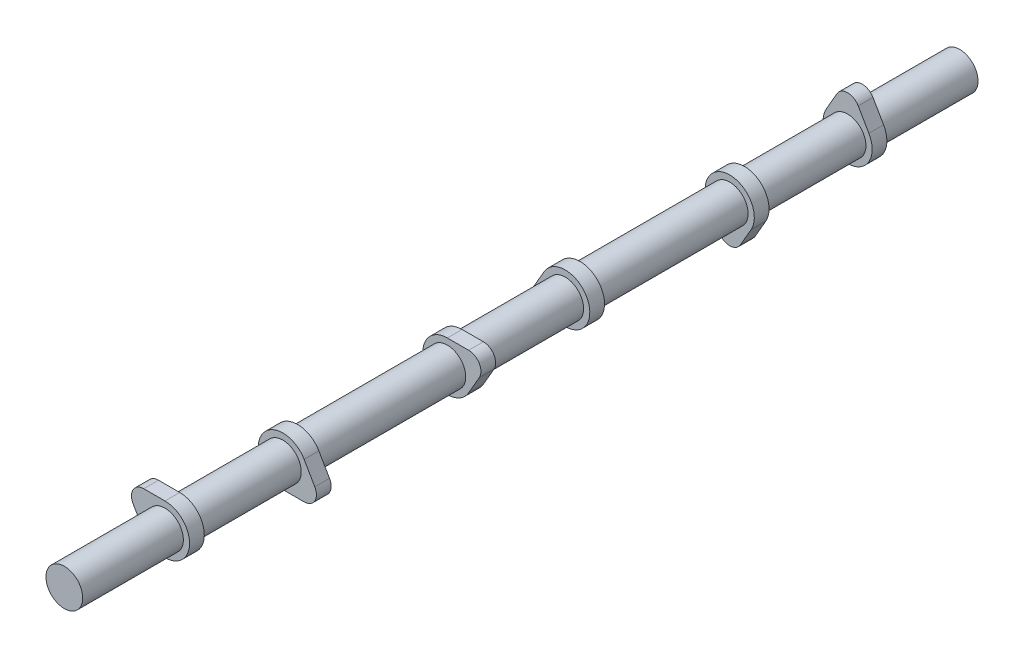
ISO-10303-21;
HEADER;
FILE_DESCRIPTION(('STEP AP214'),'2;1');
FILE_NAME('part.step','',(''),(''),'','','');
FILE_SCHEMA(('AUTOMOTIVE_DESIGN { 1 0 10303 214 1 1 1 1 }'));
ENDSEC;
DATA;
#1=APPLICATION_CONTEXT('core data for automotive mechanical design processes');
#2=APPLICATION_PROTOCOL_DEFINITION('international standard','automotive_design',2000,#1);
#3=PRODUCT_CONTEXT('',#1,'mechanical');
#4=PRODUCT('Part','Part','',(#3));
#5=PRODUCT_RELATED_PRODUCT_CATEGORY('part','',(#4));
#6=PRODUCT_DEFINITION_FORMATION('','',#4);
#7=PRODUCT_DEFINITION_CONTEXT('part definition',#1,'design');
#8=PRODUCT_DEFINITION('design','',#6,#7);
#9=PRODUCT_DEFINITION_SHAPE('','',#8);
#10=(LENGTH_UNIT() NAMED_UNIT(*) SI_UNIT(.MILLI.,.METRE.));
#11=(NAMED_UNIT(*) PLANE_ANGLE_UNIT() SI_UNIT($,.RADIAN.));
#12=(NAMED_UNIT(*) SI_UNIT($,.STERADIAN.) SOLID_ANGLE_UNIT());
#13=UNCERTAINTY_MEASURE_WITH_UNIT(LENGTH_MEASURE(1.E-05),#10,'distance_accuracy_value','');
#14=(GEOMETRIC_REPRESENTATION_CONTEXT(3) GLOBAL_UNCERTAINTY_ASSIGNED_CONTEXT((#13)) GLOBAL_UNIT_ASSIGNED_CONTEXT((#10,
#11,#12)) REPRESENTATION_CONTEXT('',''));
#15=CARTESIAN_POINT('',(0.,0.,0.));
#16=DIRECTION('',(0.,0.,1.));
#17=DIRECTION('',(1.,0.,0.));
#18=AXIS2_PLACEMENT_3D('',#15,#16,#17);
#19=CARTESIAN_POINT('',(-10.9985226280624,6.34999999999998,360.68));
#20=DIRECTION('',(0.,0.,-1.));
#21=DIRECTION('',(-0.499999999999998,-0.86602540378444,0.));
#22=AXIS2_PLACEMENT_3D('',#19,#20,#21);
#23=CYLINDRICAL_SURFACE('',#22,6.35);
#24=CARTESIAN_POINT('',(-10.9985226280624,6.34999999999998,353.06));
#25=DIRECTION('',(0.,0.,1.));
#26=DIRECTION('',(0.499999999999998,0.86602540378444,0.));
#27=AXIS2_PLACEMENT_3D('',#24,#25,#26);
#28=CIRCLE('',#27,6.35);
#29=CARTESIAN_POINT('',(-10.9985226280624,12.7,353.06));
#30=VERTEX_POINT('',#29);
#31=CARTESIAN_POINT('',(-16.4977839420936,3.17499999999996,353.06));
#32=VERTEX_POINT('',#31);
#33=EDGE_CURVE('E386',#30,#32,#28,.T.);
#34=ORIENTED_EDGE('',*,*,#33,.T.);
#35=DIRECTION('',(0.,0.,-1.));
#36=VECTOR('',#35,1.);
#37=CARTESIAN_POINT('',(-16.4977839420936,3.17499999999996,360.68));
#38=LINE('',#37,#36);
#39=CARTESIAN_POINT('',(-16.4977839420936,3.17499999999996,360.68));
#40=VERTEX_POINT('',#39);
#41=EDGE_CURVE('E405',#40,#32,#38,.T.);
#42=ORIENTED_EDGE('',*,*,#41,.F.);
#43=CARTESIAN_POINT('',(-10.9985226280624,6.34999999999998,360.68));
#44=DIRECTION('',(0.,0.,1.));
#45=DIRECTION('',(0.499999999999998,0.86602540378444,0.));
#46=AXIS2_PLACEMENT_3D('',#43,#44,#45);
#47=CIRCLE('',#46,6.35);
#48=CARTESIAN_POINT('',(-10.9985226280624,12.7,360.68));
#49=VERTEX_POINT('',#48);
#50=EDGE_CURVE('E387',#49,#40,#47,.T.);
#51=ORIENTED_EDGE('',*,*,#50,.F.);
#52=DIRECTION('',(0.,0.,-1.));
#53=VECTOR('',#52,1.);
#54=CARTESIAN_POINT('',(-10.9985226280624,12.7,360.68));
#55=LINE('',#54,#53);
#56=EDGE_CURVE('E393',#49,#30,#55,.T.);
#57=ORIENTED_EDGE('',*,*,#56,.T.);
#58=EDGE_LOOP('',(#34,#42,#51,#57));
#59=FACE_BOUND('',#58,.T.);
#60=ADVANCED_FACE('F34',(#59),#23,.T.);
#61=CARTESIAN_POINT('',(-16.4977839420936,3.17499999999996,360.68));
#62=DIRECTION('',(0.866025403784437,0.500000000000002,0.));
#63=DIRECTION('',(-0.500000000000002,0.866025403784438,0.));
#64=AXIS2_PLACEMENT_3D('',#61,#62,#63);
#65=PLANE('',#64);
#66=DIRECTION('',(0.500000000000002,-0.866025403784438,0.));
#67=VECTOR('',#66,1.);
#68=CARTESIAN_POINT('',(-16.4977839420936,3.17499999999996,353.06));
#69=LINE('',#68,#67);
#70=CARTESIAN_POINT('',(-10.9985226280624,-6.35000000000002,353.06));
#71=VERTEX_POINT('',#70);
#72=EDGE_CURVE('E396',#32,#71,#69,.T.);
#73=ORIENTED_EDGE('',*,*,#72,.T.);
#74=DIRECTION('',(0.,0.,-1.));
#75=VECTOR('',#74,1.);
#76=CARTESIAN_POINT('',(-10.9985226280624,-6.35000000000002,360.68));
#77=LINE('',#76,#75);
#78=CARTESIAN_POINT('',(-10.9985226280624,-6.35000000000002,360.68));
#79=VERTEX_POINT('',#78);
#80=EDGE_CURVE('E403',#79,#71,#77,.T.);
#81=ORIENTED_EDGE('',*,*,#80,.F.);
#82=DIRECTION('',(0.500000000000002,-0.866025403784438,0.));
#83=VECTOR('',#82,1.);
#84=CARTESIAN_POINT('',(-16.4977839420936,3.17499999999996,360.68));
#85=LINE('',#84,#83);
#86=EDGE_CURVE('E83',#40,#79,#85,.T.);
#87=ORIENTED_EDGE('',*,*,#86,.F.);
#88=ORIENTED_EDGE('',*,*,#41,.T.);
#89=EDGE_LOOP('',(#73,#81,#87,#88));
#90=FACE_BOUND('',#89,.T.);
#91=ADVANCED_FACE('F424',(#90),#65,.F.);
#92=CARTESIAN_POINT('',(0.,0.,360.68));
#93=DIRECTION('',(0.,0.,-1.));
#94=DIRECTION('',(-0.499999999999998,-0.86602540378444,0.));
#95=AXIS2_PLACEMENT_3D('',#92,#93,#94);
#96=CYLINDRICAL_SURFACE('',#95,12.7);
#97=CARTESIAN_POINT('',(0.,0.,353.06));
#98=DIRECTION('',(0.,0.,1.));
#99=DIRECTION('',(0.499999999999998,0.86602540378444,0.));
#100=AXIS2_PLACEMENT_3D('',#97,#98,#99);
#101=CIRCLE('',#100,12.7);
#102=CARTESIAN_POINT('',(0.,12.7,353.06));
#103=VERTEX_POINT('',#102);
#104=EDGE_CURVE('E69',#71,#103,#101,.T.);
#105=ORIENTED_EDGE('',*,*,#104,.T.);
#106=DIRECTION('',(0.,0.,-1.));
#107=VECTOR('',#106,1.);
#108=CARTESIAN_POINT('',(0.,12.7,360.68));
#109=LINE('',#108,#107);
#110=CARTESIAN_POINT('',(0.,12.7,360.68));
#111=VERTEX_POINT('',#110);
#112=EDGE_CURVE('E401',#111,#103,#109,.T.);
#113=ORIENTED_EDGE('',*,*,#112,.F.);
#114=CARTESIAN_POINT('',(0.,0.,360.68));
#115=DIRECTION('',(0.,0.,1.));
#116=DIRECTION('',(0.499999999999998,0.86602540378444,0.));
#117=AXIS2_PLACEMENT_3D('',#114,#115,#116);
#118=CIRCLE('',#117,12.7);
#119=EDGE_CURVE('E390',#79,#111,#118,.T.);
#120=ORIENTED_EDGE('',*,*,#119,.F.);
#121=ORIENTED_EDGE('',*,*,#80,.T.);
#122=EDGE_LOOP('',(#105,#113,#120,#121));
#123=FACE_BOUND('',#122,.T.);
#124=ADVANCED_FACE('F423',(#123),#96,.T.);
#125=CARTESIAN_POINT('',(-10.9985226280624,12.7,360.68));
#126=DIRECTION('',(0.,-1.,0.));
#127=DIRECTION('',(1.,0.,0.));
#128=AXIS2_PLACEMENT_3D('',#125,#126,#127);
#129=PLANE('',#128);
#130=DIRECTION('',(-1.,0.,0.));
#131=VECTOR('',#130,1.);
#132=CARTESIAN_POINT('',(-10.9985226280624,12.7,353.06));
#133=LINE('',#132,#131);
#134=EDGE_CURVE('E75',#103,#30,#133,.T.);
#135=ORIENTED_EDGE('',*,*,#134,.T.);
#136=ORIENTED_EDGE('',*,*,#56,.F.);
#137=DIRECTION('',(-1.,0.,0.));
#138=VECTOR('',#137,1.);
#139=CARTESIAN_POINT('',(-10.9985226280624,12.7,360.68));
#140=LINE('',#139,#138);
#141=EDGE_CURVE('E51',#111,#49,#140,.T.);
#142=ORIENTED_EDGE('',*,*,#141,.F.);
#143=ORIENTED_EDGE('',*,*,#112,.T.);
#144=EDGE_LOOP('',(#135,#136,#142,#143));
#145=FACE_BOUND('',#144,.T.);
#146=ADVANCED_FACE('F421',(#145),#129,.F.);
#147=CARTESIAN_POINT('',(-10.9985226280624,6.34999999999998,360.68));
#148=DIRECTION('',(0.,0.,1.));
#149=DIRECTION('',(0.499999999999998,0.86602540378444,0.));
#150=AXIS2_PLACEMENT_3D('',#147,#148,#149);
#151=PLANE('',#150);
#152=CARTESIAN_POINT('',(0.,0.,360.68));
#153=DIRECTION('',(0.,0.,1.));
#154=DIRECTION('',(-0.499999999999992,-0.866025403784443,0.));
#155=AXIS2_PLACEMENT_3D('',#152,#153,#154);
#156=CIRCLE('',#155,9.5);
#157=CARTESIAN_POINT('',(-4.74999999999992,-8.22724133595221,360.68));
#158=VERTEX_POINT('',#157);
#159=EDGE_CURVE('E383',#158,#158,#156,.F.);
#160=ORIENTED_EDGE('',*,*,#159,.T.);
#161=EDGE_LOOP('',(#160));
#162=FACE_BOUND('',#161,.T.);
#163=ORIENTED_EDGE('',*,*,#50,.T.);
#164=ORIENTED_EDGE('',*,*,#86,.T.);
#165=ORIENTED_EDGE('',*,*,#119,.T.);
#166=ORIENTED_EDGE('',*,*,#141,.T.);
#167=EDGE_LOOP('',(#163,#164,#165,#166));
#168=FACE_BOUND('',#167,.T.);
#169=ADVANCED_FACE('F415',(#162,#168),#151,.T.);
#170=CARTESIAN_POINT('',(-10.9985226280624,6.34999999999998,353.06));
#171=DIRECTION('',(0.,0.,1.));
#172=DIRECTION('',(0.499999999999998,0.86602540378444,0.));
#173=AXIS2_PLACEMENT_3D('',#170,#171,#172);
#174=PLANE('',#173);
#175=CARTESIAN_POINT('',(0.,0.,353.06));
#176=DIRECTION('',(0.,0.,1.));
#177=DIRECTION('',(-0.499999999999992,-0.866025403784443,0.));
#178=AXIS2_PLACEMENT_3D('',#175,#176,#177);
#179=CIRCLE('',#178,9.5);
#180=CARTESIAN_POINT('',(-4.74999999999992,-8.22724133595221,353.06));
#181=VERTEX_POINT('',#180);
#182=EDGE_CURVE('E43',#181,#181,#179,.F.);
#183=ORIENTED_EDGE('',*,*,#182,.F.);
#184=EDGE_LOOP('',(#183));
#185=FACE_BOUND('',#184,.T.);
#186=ORIENTED_EDGE('',*,*,#33,.F.);
#187=ORIENTED_EDGE('',*,*,#134,.F.);
#188=ORIENTED_EDGE('',*,*,#104,.F.);
#189=ORIENTED_EDGE('',*,*,#72,.F.);
#190=EDGE_LOOP('',(#186,#187,#188,#189));
#191=FACE_BOUND('',#190,.T.);
#192=ADVANCED_FACE('F412',(#185,#191),#174,.F.);
#193=CARTESIAN_POINT('',(0.,0.,412.75));
#194=DIRECTION('',(0.,0.,-1.));
#195=DIRECTION('',(0.499999999999992,0.866025403784443,0.));
#196=AXIS2_PLACEMENT_3D('',#193,#194,#195);
#197=CYLINDRICAL_SURFACE('',#196,9.5);
#198=CARTESIAN_POINT('',(0.,0.,299.72));
#199=DIRECTION('',(0.,0.,1.));
#200=DIRECTION('',(-0.499999999999992,-0.866025403784443,0.));
#201=AXIS2_PLACEMENT_3D('',#198,#199,#200);
#202=CIRCLE('',#201,9.5);
#203=CARTESIAN_POINT('',(-4.74999999999992,-8.22724133595221,299.72));
#204=VERTEX_POINT('',#203);
#205=EDGE_CURVE('E37',#204,#204,#202,.T.);
#206=ORIENTED_EDGE('',*,*,#205,.T.);
#207=EDGE_LOOP('',(#206));
#208=FACE_BOUND('',#207,.T.);
#209=ORIENTED_EDGE('',*,*,#182,.T.);
#210=EDGE_LOOP('',(#209));
#211=FACE_BOUND('',#210,.T.);
#212=ADVANCED_FACE('F410',(#208,#211),#197,.T.);
#213=ORIENTED_EDGE('',*,*,#159,.F.);
#214=EDGE_LOOP('',(#213));
#215=FACE_BOUND('',#214,.T.);
#216=CARTESIAN_POINT('',(0.,0.,412.75));
#217=DIRECTION('',(0.,0.,1.));
#218=DIRECTION('',(-0.499999999999992,-0.866025403784443,0.));
#219=AXIS2_PLACEMENT_3D('',#216,#217,#218);
#220=CIRCLE('',#219,9.5);
#221=CARTESIAN_POINT('',(-4.74999999999992,-8.22724133595221,412.75));
#222=VERTEX_POINT('',#221);
#223=EDGE_CURVE('E380',#222,#222,#220,.T.);
#224=ORIENTED_EDGE('',*,*,#223,.F.);
#225=EDGE_LOOP('',(#224));
#226=FACE_BOUND('',#225,.T.);
#227=ADVANCED_FACE('F437',(#215,#226),#197,.T.);
#228=CARTESIAN_POINT('',(0.,0.,412.75));
#229=DIRECTION('',(0.,0.,1.));
#230=DIRECTION('',(-0.499999999999992,-0.866025403784443,0.));
#231=AXIS2_PLACEMENT_3D('',#228,#229,#230);
#232=PLANE('',#231);
#233=ORIENTED_EDGE('',*,*,#223,.T.);
#234=EDGE_LOOP('',(#233));
#235=FACE_BOUND('',#234,.T.);
#236=ADVANCED_FACE('F440',(#235),#232,.T.);
#237=CARTESIAN_POINT('',(10.9985226280624,-6.3499999999999,299.72));
#238=DIRECTION('',(0.,0.,-1.));
#239=DIRECTION('',(0.499999999999992,0.866025403784443,0.));
#240=AXIS2_PLACEMENT_3D('',#237,#238,#239);
#241=CYLINDRICAL_SURFACE('',#240,6.35);
#242=CARTESIAN_POINT('',(10.9985226280624,-6.3499999999999,292.1));
#243=DIRECTION('',(0.,0.,1.));
#244=DIRECTION('',(-0.499999999999992,-0.866025403784443,0.));
#245=AXIS2_PLACEMENT_3D('',#242,#243,#244);
#246=CIRCLE('',#245,6.35);
#247=CARTESIAN_POINT('',(10.9985226280625,-12.6999999999999,292.1));
#248=VERTEX_POINT('',#247);
#249=CARTESIAN_POINT('',(16.4977839420936,-3.17499999999985,292.1));
#250=VERTEX_POINT('',#249);
#251=EDGE_CURVE('E348',#248,#250,#246,.T.);
#252=ORIENTED_EDGE('',*,*,#251,.T.);
#253=DIRECTION('',(0.,0.,-1.));
#254=VECTOR('',#253,1.);
#255=CARTESIAN_POINT('',(16.4977839420936,-3.17499999999985,299.72));
#256=LINE('',#255,#254);
#257=CARTESIAN_POINT('',(16.4977839420936,-3.17499999999985,299.72));
#258=VERTEX_POINT('',#257);
#259=EDGE_CURVE('E377',#258,#250,#256,.T.);
#260=ORIENTED_EDGE('',*,*,#259,.F.);
#261=CARTESIAN_POINT('',(10.9985226280624,-6.3499999999999,299.72));
#262=DIRECTION('',(0.,0.,1.));
#263=DIRECTION('',(-0.499999999999992,-0.866025403784443,0.));
#264=AXIS2_PLACEMENT_3D('',#261,#262,#263);
#265=CIRCLE('',#264,6.35);
#266=CARTESIAN_POINT('',(10.9985226280625,-12.6999999999999,299.72));
#267=VERTEX_POINT('',#266);
#268=EDGE_CURVE('E351',#267,#258,#265,.T.);
#269=ORIENTED_EDGE('',*,*,#268,.F.);
#270=DIRECTION('',(0.,0.,-1.));
#271=VECTOR('',#270,1.);
#272=CARTESIAN_POINT('',(10.9985226280625,-12.6999999999999,299.72));
#273=LINE('',#272,#271);
#274=EDGE_CURVE('E361',#267,#248,#273,.T.);
#275=ORIENTED_EDGE('',*,*,#274,.T.);
#276=EDGE_LOOP('',(#252,#260,#269,#275));
#277=FACE_BOUND('',#276,.T.);
#278=ADVANCED_FACE('F445',(#277),#241,.T.);
#279=CARTESIAN_POINT('',(16.4977839420936,-3.17499999999985,299.72));
#280=DIRECTION('',(-0.866025403784434,-0.500000000000008,0.));
#281=DIRECTION('',(0.500000000000008,-0.866025403784434,0.));
#282=AXIS2_PLACEMENT_3D('',#279,#280,#281);
#283=PLANE('',#282);
#284=DIRECTION('',(-0.500000000000008,0.866025403784434,0.));
#285=VECTOR('',#284,1.);
#286=CARTESIAN_POINT('',(16.4977839420936,-3.17499999999985,292.1));
#287=LINE('',#286,#285);
#288=CARTESIAN_POINT('',(10.9985226280623,6.3500000000001,292.1));
#289=VERTEX_POINT('',#288);
#290=EDGE_CURVE('E364',#250,#289,#287,.T.);
#291=ORIENTED_EDGE('',*,*,#290,.T.);
#292=DIRECTION('',(0.,0.,-1.));
#293=VECTOR('',#292,1.);
#294=CARTESIAN_POINT('',(10.9985226280623,6.3500000000001,299.72));
#295=LINE('',#294,#293);
#296=CARTESIAN_POINT('',(10.9985226280623,6.3500000000001,299.72));
#297=VERTEX_POINT('',#296);
#298=EDGE_CURVE('E374',#297,#289,#295,.T.);
#299=ORIENTED_EDGE('',*,*,#298,.F.);
#300=DIRECTION('',(-0.500000000000008,0.866025403784434,0.));
#301=VECTOR('',#300,1.);
#302=CARTESIAN_POINT('',(16.4977839420936,-3.17499999999985,299.72));
#303=LINE('',#302,#301);
#304=EDGE_CURVE('E354',#258,#297,#303,.T.);
#305=ORIENTED_EDGE('',*,*,#304,.F.);
#306=ORIENTED_EDGE('',*,*,#259,.T.);
#307=EDGE_LOOP('',(#291,#299,#305,#306));
#308=FACE_BOUND('',#307,.T.);
#309=ADVANCED_FACE('F449',(#308),#283,.F.);
#310=CARTESIAN_POINT('',(0.,0.,299.72));
#311=DIRECTION('',(0.,0.,-1.));
#312=DIRECTION('',(0.499999999999992,0.866025403784443,0.));
#313=AXIS2_PLACEMENT_3D('',#310,#311,#312);
#314=CYLINDRICAL_SURFACE('',#313,12.7);
#315=CARTESIAN_POINT('',(0.,0.,292.1));
#316=DIRECTION('',(0.,0.,1.));
#317=DIRECTION('',(-0.499999999999992,-0.866025403784443,0.));
#318=AXIS2_PLACEMENT_3D('',#315,#316,#317);
#319=CIRCLE('',#318,12.7);
#320=CARTESIAN_POINT('',(1.17961196366423E-13,-12.7,292.1));
#321=VERTEX_POINT('',#320);
#322=EDGE_CURVE('E366',#289,#321,#319,.T.);
#323=ORIENTED_EDGE('',*,*,#322,.T.);
#324=DIRECTION('',(0.,0.,-1.));
#325=VECTOR('',#324,1.);
#326=CARTESIAN_POINT('',(1.17961196366423E-13,-12.7,299.72));
#327=LINE('',#326,#325);
#328=CARTESIAN_POINT('',(1.17961196366423E-13,-12.7,299.72));
#329=VERTEX_POINT('',#328);
#330=EDGE_CURVE('E371',#329,#321,#327,.T.);
#331=ORIENTED_EDGE('',*,*,#330,.F.);
#332=CARTESIAN_POINT('',(0.,0.,299.72));
#333=DIRECTION('',(0.,0.,1.));
#334=DIRECTION('',(-0.499999999999992,-0.866025403784443,0.));
#335=AXIS2_PLACEMENT_3D('',#332,#333,#334);
#336=CIRCLE('',#335,12.7);
#337=EDGE_CURVE('E357',#297,#329,#336,.T.);
#338=ORIENTED_EDGE('',*,*,#337,.F.);
#339=ORIENTED_EDGE('',*,*,#298,.T.);
#340=EDGE_LOOP('',(#323,#331,#338,#339));
#341=FACE_BOUND('',#340,.T.);
#342=ADVANCED_FACE('F453',(#341),#314,.T.);
#343=CARTESIAN_POINT('',(10.9985226280625,-12.6999999999999,299.72));
#344=DIRECTION('',(0.,1.,0.));
#345=DIRECTION('',(-1.,0.,0.));
#346=AXIS2_PLACEMENT_3D('',#343,#344,#345);
#347=PLANE('',#346);
#348=DIRECTION('',(1.,0.,0.));
#349=VECTOR('',#348,1.);
#350=CARTESIAN_POINT('',(10.9985226280625,-12.6999999999999,292.1));
#351=LINE('',#350,#349);
#352=EDGE_CURVE('E355',#321,#248,#351,.T.);
#353=ORIENTED_EDGE('',*,*,#352,.T.);
#354=ORIENTED_EDGE('',*,*,#274,.F.);
#355=DIRECTION('',(1.,0.,0.));
#356=VECTOR('',#355,1.);
#357=CARTESIAN_POINT('',(10.9985226280625,-12.6999999999999,299.72));
#358=LINE('',#357,#356);
#359=EDGE_CURVE('E359',#329,#267,#358,.T.);
#360=ORIENTED_EDGE('',*,*,#359,.F.);
#361=ORIENTED_EDGE('',*,*,#330,.T.);
#362=EDGE_LOOP('',(#353,#354,#360,#361));
#363=FACE_BOUND('',#362,.T.);
#364=ADVANCED_FACE('F457',(#363),#347,.F.);
#365=CARTESIAN_POINT('',(10.9985226280624,-6.3499999999999,299.72));
#366=DIRECTION('',(0.,0.,1.));
#367=DIRECTION('',(-0.499999999999992,-0.866025403784443,0.));
#368=AXIS2_PLACEMENT_3D('',#365,#366,#367);
#369=PLANE('',#368);
#370=ORIENTED_EDGE('',*,*,#205,.F.);
#371=EDGE_LOOP('',(#370));
#372=FACE_BOUND('',#371,.T.);
#373=ORIENTED_EDGE('',*,*,#268,.T.);
#374=ORIENTED_EDGE('',*,*,#304,.T.);
#375=ORIENTED_EDGE('',*,*,#337,.T.);
#376=ORIENTED_EDGE('',*,*,#359,.T.);
#377=EDGE_LOOP('',(#373,#374,#375,#376));
#378=FACE_BOUND('',#377,.T.);
#379=ADVANCED_FACE('F461',(#372,#378),#369,.T.);
#380=CARTESIAN_POINT('',(10.9985226280624,-6.3499999999999,292.1));
#381=DIRECTION('',(0.,0.,1.));
#382=DIRECTION('',(-0.499999999999992,-0.866025403784443,0.));
#383=AXIS2_PLACEMENT_3D('',#380,#381,#382);
#384=PLANE('',#383);
#385=CARTESIAN_POINT('',(0.,0.,292.1));
#386=DIRECTION('',(0.,0.,1.));
#387=DIRECTION('',(-0.499999999999992,-0.866025403784443,0.));
#388=AXIS2_PLACEMENT_3D('',#385,#386,#387);
#389=CIRCLE('',#388,9.5);
#390=CARTESIAN_POINT('',(-4.74999999999992,-8.22724133595221,292.1));
#391=VERTEX_POINT('',#390);
#392=EDGE_CURVE('E11',#391,#391,#389,.T.);
#393=ORIENTED_EDGE('',*,*,#392,.T.);
#394=EDGE_LOOP('',(#393));
#395=FACE_BOUND('',#394,.T.);
#396=ORIENTED_EDGE('',*,*,#251,.F.);
#397=ORIENTED_EDGE('',*,*,#352,.F.);
#398=ORIENTED_EDGE('',*,*,#322,.F.);
#399=ORIENTED_EDGE('',*,*,#290,.F.);
#400=EDGE_LOOP('',(#396,#397,#398,#399));
#401=FACE_BOUND('',#400,.T.);
#402=ADVANCED_FACE('F463',(#395,#401),#384,.F.);
#403=ORIENTED_EDGE('',*,*,#392,.F.);
#404=EDGE_LOOP('',(#403));
#405=FACE_BOUND('',#404,.T.);
#406=CARTESIAN_POINT('',(0.,0.,214.63));
#407=DIRECTION('',(0.,0.,1.));
#408=DIRECTION('',(-0.500000000000004,0.866025403784436,0.));
#409=AXIS2_PLACEMENT_3D('',#406,#407,#408);
#410=CIRCLE('',#409,9.5);
#411=CARTESIAN_POINT('',(-4.75000000000004,8.22724133595215,214.63));
#412=VERTEX_POINT('',#411);
#413=EDGE_CURVE('E309',#412,#412,#410,.F.);
#414=ORIENTED_EDGE('',*,*,#413,.F.);
#415=EDGE_LOOP('',(#414));
#416=FACE_BOUND('',#415,.T.);
#417=ADVANCED_FACE('F442',(#405,#416),#197,.T.);
#418=CARTESIAN_POINT('',(10.9985226280624,6.34999999999998,214.63));
#419=DIRECTION('',(0.,0.,-1.));
#420=DIRECTION('',(-0.499999999999998,0.86602540378444,0.));
#421=AXIS2_PLACEMENT_3D('',#418,#419,#420);
#422=CYLINDRICAL_SURFACE('',#421,6.35);
#423=CARTESIAN_POINT('',(10.9985226280624,6.34999999999998,207.01));
#424=DIRECTION('',(0.,0.,1.));
#425=DIRECTION('',(0.499999999999998,-0.86602540378444,0.));
#426=AXIS2_PLACEMENT_3D('',#423,#424,#425);
#427=CIRCLE('',#426,6.35);
#428=CARTESIAN_POINT('',(16.4977839420936,3.17499999999996,207.01));
#429=VERTEX_POINT('',#428);
#430=CARTESIAN_POINT('',(10.9985226280624,12.7,207.01));
#431=VERTEX_POINT('',#430);
#432=EDGE_CURVE('E312',#429,#431,#427,.T.);
#433=ORIENTED_EDGE('',*,*,#432,.T.);
#434=DIRECTION('',(0.,0.,-1.));
#435=VECTOR('',#434,1.);
#436=CARTESIAN_POINT('',(10.9985226280624,12.7,214.63));
#437=LINE('',#436,#435);
#438=CARTESIAN_POINT('',(10.9985226280624,12.7,214.63));
#439=VERTEX_POINT('',#438);
#440=EDGE_CURVE('E339',#439,#431,#437,.T.);
#441=ORIENTED_EDGE('',*,*,#440,.F.);
#442=CARTESIAN_POINT('',(10.9985226280624,6.34999999999998,214.63));
#443=DIRECTION('',(0.,0.,1.));
#444=DIRECTION('',(0.499999999999998,-0.86602540378444,0.));
#445=AXIS2_PLACEMENT_3D('',#442,#443,#444);
#446=CIRCLE('',#445,6.35);
#447=CARTESIAN_POINT('',(16.4977839420936,3.17499999999996,214.63));
#448=VERTEX_POINT('',#447);
#449=EDGE_CURVE('E313',#448,#439,#446,.T.);
#450=ORIENTED_EDGE('',*,*,#449,.F.);
#451=DIRECTION('',(0.,0.,-1.));
#452=VECTOR('',#451,1.);
#453=CARTESIAN_POINT('',(16.4977839420936,3.17499999999996,214.63));
#454=LINE('',#453,#452);
#455=EDGE_CURVE('E323',#448,#429,#454,.T.);
#456=ORIENTED_EDGE('',*,*,#455,.T.);
#457=EDGE_LOOP('',(#433,#441,#450,#456));
#458=FACE_BOUND('',#457,.T.);
#459=ADVANCED_FACE('F470',(#458),#422,.T.);
#460=CARTESIAN_POINT('',(10.9985226280624,12.7,214.63));
#461=DIRECTION('',(0.,-1.,0.));
#462=DIRECTION('',(1.,0.,0.));
#463=AXIS2_PLACEMENT_3D('',#460,#461,#462);
#464=PLANE('',#463);
#465=DIRECTION('',(-1.,0.,0.));
#466=VECTOR('',#465,1.);
#467=CARTESIAN_POINT('',(10.9985226280624,12.7,207.01));
#468=LINE('',#467,#466);
#469=CARTESIAN_POINT('',(0.,12.7,207.01));
#470=VERTEX_POINT('',#469);
#471=EDGE_CURVE('E326',#431,#470,#468,.T.);
#472=ORIENTED_EDGE('',*,*,#471,.T.);
#473=DIRECTION('',(0.,0.,-1.));
#474=VECTOR('',#473,1.);
#475=CARTESIAN_POINT('',(0.,12.7,214.63));
#476=LINE('',#475,#474);
#477=CARTESIAN_POINT('',(0.,12.7,214.63));
#478=VERTEX_POINT('',#477);
#479=EDGE_CURVE('E336',#478,#470,#476,.T.);
#480=ORIENTED_EDGE('',*,*,#479,.F.);
#481=DIRECTION('',(-1.,0.,0.));
#482=VECTOR('',#481,1.);
#483=CARTESIAN_POINT('',(10.9985226280624,12.7,214.63));
#484=LINE('',#483,#482);
#485=EDGE_CURVE('E316',#439,#478,#484,.T.);
#486=ORIENTED_EDGE('',*,*,#485,.F.);
#487=ORIENTED_EDGE('',*,*,#440,.T.);
#488=EDGE_LOOP('',(#472,#480,#486,#487));
#489=FACE_BOUND('',#488,.T.);
#490=ADVANCED_FACE('F473',(#489),#464,.F.);
#491=CARTESIAN_POINT('',(0.,0.,214.63));
#492=DIRECTION('',(0.,0.,-1.));
#493=DIRECTION('',(-0.499999999999998,0.86602540378444,0.));
#494=AXIS2_PLACEMENT_3D('',#491,#492,#493);
#495=CYLINDRICAL_SURFACE('',#494,12.7);
#496=CARTESIAN_POINT('',(0.,0.,207.01));
#497=DIRECTION('',(0.,0.,1.));
#498=DIRECTION('',(0.499999999999998,-0.86602540378444,0.));
#499=AXIS2_PLACEMENT_3D('',#496,#497,#498);
#500=CIRCLE('',#499,12.7);
#501=CARTESIAN_POINT('',(10.9985226280624,-6.35000000000002,207.01));
#502=VERTEX_POINT('',#501);
#503=EDGE_CURVE('E328',#470,#502,#500,.T.);
#504=ORIENTED_EDGE('',*,*,#503,.T.);
#505=DIRECTION('',(0.,0.,-1.));
#506=VECTOR('',#505,1.);
#507=CARTESIAN_POINT('',(10.9985226280624,-6.35000000000002,214.63));
#508=LINE('',#507,#506);
#509=CARTESIAN_POINT('',(10.9985226280624,-6.35000000000002,214.63));
#510=VERTEX_POINT('',#509);
#511=EDGE_CURVE('E333',#510,#502,#508,.T.);
#512=ORIENTED_EDGE('',*,*,#511,.F.);
#513=CARTESIAN_POINT('',(0.,0.,214.63));
#514=DIRECTION('',(0.,0.,1.));
#515=DIRECTION('',(0.499999999999998,-0.86602540378444,0.));
#516=AXIS2_PLACEMENT_3D('',#513,#514,#515);
#517=CIRCLE('',#516,12.7);
#518=EDGE_CURVE('E319',#478,#510,#517,.T.);
#519=ORIENTED_EDGE('',*,*,#518,.F.);
#520=ORIENTED_EDGE('',*,*,#479,.T.);
#521=EDGE_LOOP('',(#504,#512,#519,#520));
#522=FACE_BOUND('',#521,.T.);
#523=ADVANCED_FACE('F477',(#522),#495,.T.);
#524=CARTESIAN_POINT('',(16.4977839420936,3.17499999999996,214.63));
#525=DIRECTION('',(-0.866025403784437,0.500000000000003,0.));
#526=DIRECTION('',(-0.500000000000003,-0.866025403784437,0.));
#527=AXIS2_PLACEMENT_3D('',#524,#525,#526);
#528=PLANE('',#527);
#529=DIRECTION('',(0.500000000000003,0.866025403784437,0.));
#530=VECTOR('',#529,1.);
#531=CARTESIAN_POINT('',(16.4977839420936,3.17499999999996,207.01));
#532=LINE('',#531,#530);
#533=EDGE_CURVE('E317',#502,#429,#532,.T.);
#534=ORIENTED_EDGE('',*,*,#533,.T.);
#535=ORIENTED_EDGE('',*,*,#455,.F.);
#536=DIRECTION('',(0.500000000000003,0.866025403784437,0.));
#537=VECTOR('',#536,1.);
#538=CARTESIAN_POINT('',(16.4977839420936,3.17499999999996,214.63));
#539=LINE('',#538,#537);
#540=EDGE_CURVE('E321',#510,#448,#539,.T.);
#541=ORIENTED_EDGE('',*,*,#540,.F.);
#542=ORIENTED_EDGE('',*,*,#511,.T.);
#543=EDGE_LOOP('',(#534,#535,#541,#542));
#544=FACE_BOUND('',#543,.T.);
#545=ADVANCED_FACE('F481',(#544),#528,.F.);
#546=CARTESIAN_POINT('',(10.9985226280624,6.34999999999998,214.63));
#547=DIRECTION('',(0.,0.,1.));
#548=DIRECTION('',(0.499999999999998,-0.86602540378444,0.));
#549=AXIS2_PLACEMENT_3D('',#546,#547,#548);
#550=PLANE('',#549);
#551=ORIENTED_EDGE('',*,*,#413,.T.);
#552=EDGE_LOOP('',(#551));
#553=FACE_BOUND('',#552,.T.);
#554=ORIENTED_EDGE('',*,*,#449,.T.);
#555=ORIENTED_EDGE('',*,*,#485,.T.);
#556=ORIENTED_EDGE('',*,*,#518,.T.);
#557=ORIENTED_EDGE('',*,*,#540,.T.);
#558=EDGE_LOOP('',(#554,#555,#556,#557));
#559=FACE_BOUND('',#558,.T.);
#560=ADVANCED_FACE('F485',(#553,#559),#550,.T.);
#561=CARTESIAN_POINT('',(10.9985226280624,6.34999999999998,207.01));
#562=DIRECTION('',(0.,0.,1.));
#563=DIRECTION('',(0.499999999999998,-0.86602540378444,0.));
#564=AXIS2_PLACEMENT_3D('',#561,#562,#563);
#565=PLANE('',#564);
#566=CARTESIAN_POINT('',(0.,0.,207.01));
#567=DIRECTION('',(0.,0.,1.));
#568=DIRECTION('',(-0.500000000000004,0.866025403784436,0.));
#569=AXIS2_PLACEMENT_3D('',#566,#567,#568);
#570=CIRCLE('',#569,9.5);
#571=CARTESIAN_POINT('',(-4.75000000000004,8.22724133595215,207.01));
#572=VERTEX_POINT('',#571);
#573=EDGE_CURVE('E342',#572,#572,#570,.F.);
#574=ORIENTED_EDGE('',*,*,#573,.F.);
#575=EDGE_LOOP('',(#574));
#576=FACE_BOUND('',#575,.T.);
#577=ORIENTED_EDGE('',*,*,#432,.F.);
#578=ORIENTED_EDGE('',*,*,#533,.F.);
#579=ORIENTED_EDGE('',*,*,#503,.F.);
#580=ORIENTED_EDGE('',*,*,#471,.F.);
#581=EDGE_LOOP('',(#577,#578,#579,#580));
#582=FACE_BOUND('',#581,.T.);
#583=ADVANCED_FACE('F487',(#576,#582),#565,.F.);
#584=CARTESIAN_POINT('',(0.,0.,266.7));
#585=DIRECTION('',(0.,0.,-1.));
#586=DIRECTION('',(0.500000000000004,-0.866025403784436,0.));
#587=AXIS2_PLACEMENT_3D('',#584,#585,#586);
#588=CYLINDRICAL_SURFACE('',#587,9.5);
#589=CARTESIAN_POINT('',(0.,0.,153.67));
#590=DIRECTION('',(0.,0.,1.));
#591=DIRECTION('',(-0.500000000000004,0.866025403784436,0.));
#592=AXIS2_PLACEMENT_3D('',#589,#590,#591);
#593=CIRCLE('',#592,9.5);
#594=CARTESIAN_POINT('',(-4.75000000000004,8.22724133595215,153.67));
#595=VERTEX_POINT('',#594);
#596=EDGE_CURVE('E308',#595,#595,#593,.T.);
#597=ORIENTED_EDGE('',*,*,#596,.T.);
#598=EDGE_LOOP('',(#597));
#599=FACE_BOUND('',#598,.T.);
#600=ORIENTED_EDGE('',*,*,#573,.T.);
#601=EDGE_LOOP('',(#600));
#602=FACE_BOUND('',#601,.T.);
#603=ADVANCED_FACE('F490',(#599,#602),#588,.T.);
#604=CARTESIAN_POINT('',(-10.9985226280623,-6.35000000000005,153.67));
#605=DIRECTION('',(0.,0.,-1.));
#606=DIRECTION('',(0.500000000000004,-0.866025403784436,0.));
#607=AXIS2_PLACEMENT_3D('',#604,#605,#606);
#608=CYLINDRICAL_SURFACE('',#607,6.35);
#609=CARTESIAN_POINT('',(-10.9985226280623,-6.35000000000005,146.05));
#610=DIRECTION('',(0.,0.,1.));
#611=DIRECTION('',(-0.500000000000004,0.866025403784436,0.));
#612=AXIS2_PLACEMENT_3D('',#609,#610,#611);
#613=CIRCLE('',#612,6.35);
#614=CARTESIAN_POINT('',(-16.4977839420935,-3.17500000000008,146.05));
#615=VERTEX_POINT('',#614);
#616=CARTESIAN_POINT('',(-10.9985226280623,-12.7000000000001,146.05));
#617=VERTEX_POINT('',#616);
#618=EDGE_CURVE('E277',#615,#617,#613,.T.);
#619=ORIENTED_EDGE('',*,*,#618,.T.);
#620=DIRECTION('',(0.,0.,-1.));
#621=VECTOR('',#620,1.);
#622=CARTESIAN_POINT('',(-10.9985226280623,-12.7000000000001,153.67));
#623=LINE('',#622,#621);
#624=CARTESIAN_POINT('',(-10.9985226280623,-12.7000000000001,153.67));
#625=VERTEX_POINT('',#624);
#626=EDGE_CURVE('E305',#625,#617,#623,.T.);
#627=ORIENTED_EDGE('',*,*,#626,.F.);
#628=CARTESIAN_POINT('',(-10.9985226280623,-6.35000000000005,153.67));
#629=DIRECTION('',(0.,0.,1.));
#630=DIRECTION('',(-0.500000000000004,0.866025403784436,0.));
#631=AXIS2_PLACEMENT_3D('',#628,#629,#630);
#632=CIRCLE('',#631,6.35);
#633=CARTESIAN_POINT('',(-16.4977839420935,-3.17500000000008,153.67));
#634=VERTEX_POINT('',#633);
#635=EDGE_CURVE('E279',#634,#625,#632,.T.);
#636=ORIENTED_EDGE('',*,*,#635,.F.);
#637=DIRECTION('',(0.,0.,-1.));
#638=VECTOR('',#637,1.);
#639=CARTESIAN_POINT('',(-16.4977839420935,-3.17500000000008,153.67));
#640=LINE('',#639,#638);
#641=EDGE_CURVE('E289',#634,#615,#640,.T.);
#642=ORIENTED_EDGE('',*,*,#641,.T.);
#643=EDGE_LOOP('',(#619,#627,#636,#642));
#644=FACE_BOUND('',#643,.T.);
#645=ADVANCED_FACE('F501',(#644),#608,.T.);
#646=CARTESIAN_POINT('',(-10.9985226280623,-12.7000000000001,153.67));
#647=DIRECTION('',(0.,1.,0.));
#648=DIRECTION('',(-1.,0.,0.));
#649=AXIS2_PLACEMENT_3D('',#646,#647,#648);
#650=PLANE('',#649);
#651=DIRECTION('',(1.,0.,0.));
#652=VECTOR('',#651,1.);
#653=CARTESIAN_POINT('',(-10.9985226280623,-12.7000000000001,146.05));
#654=LINE('',#653,#652);
#655=CARTESIAN_POINT('',(0.,-12.7,146.05));
#656=VERTEX_POINT('',#655);
#657=EDGE_CURVE('E292',#617,#656,#654,.T.);
#658=ORIENTED_EDGE('',*,*,#657,.T.);
#659=DIRECTION('',(0.,0.,-1.));
#660=VECTOR('',#659,1.);
#661=CARTESIAN_POINT('',(0.,-12.7,153.67));
#662=LINE('',#661,#660);
#663=CARTESIAN_POINT('',(0.,-12.7,153.67));
#664=VERTEX_POINT('',#663);
#665=EDGE_CURVE('E302',#664,#656,#662,.T.);
#666=ORIENTED_EDGE('',*,*,#665,.F.);
#667=DIRECTION('',(1.,0.,0.));
#668=VECTOR('',#667,1.);
#669=CARTESIAN_POINT('',(-10.9985226280623,-12.7000000000001,153.67));
#670=LINE('',#669,#668);
#671=EDGE_CURVE('E282',#625,#664,#670,.T.);
#672=ORIENTED_EDGE('',*,*,#671,.F.);
#673=ORIENTED_EDGE('',*,*,#626,.T.);
#674=EDGE_LOOP('',(#658,#666,#672,#673));
#675=FACE_BOUND('',#674,.T.);
#676=ADVANCED_FACE('F504',(#675),#650,.F.);
#677=CARTESIAN_POINT('',(0.,0.,153.67));
#678=DIRECTION('',(0.,0.,-1.));
#679=DIRECTION('',(0.500000000000004,-0.866025403784436,0.));
#680=AXIS2_PLACEMENT_3D('',#677,#678,#679);
#681=CYLINDRICAL_SURFACE('',#680,12.7);
#682=CARTESIAN_POINT('',(0.,0.,146.05));
#683=DIRECTION('',(0.,0.,1.));
#684=DIRECTION('',(-0.500000000000004,0.866025403784436,0.));
#685=AXIS2_PLACEMENT_3D('',#682,#683,#684);
#686=CIRCLE('',#685,12.7);
#687=CARTESIAN_POINT('',(-10.9985226280624,6.34999999999995,146.05));
#688=VERTEX_POINT('',#687);
#689=EDGE_CURVE('E294',#656,#688,#686,.T.);
#690=ORIENTED_EDGE('',*,*,#689,.T.);
#691=DIRECTION('',(0.,0.,-1.));
#692=VECTOR('',#691,1.);
#693=CARTESIAN_POINT('',(-10.9985226280624,6.34999999999995,153.67));
#694=LINE('',#693,#692);
#695=CARTESIAN_POINT('',(-10.9985226280624,6.34999999999995,153.67));
#696=VERTEX_POINT('',#695);
#697=EDGE_CURVE('E299',#696,#688,#694,.T.);
#698=ORIENTED_EDGE('',*,*,#697,.F.);
#699=CARTESIAN_POINT('',(0.,0.,153.67));
#700=DIRECTION('',(0.,0.,1.));
#701=DIRECTION('',(-0.500000000000004,0.866025403784436,0.));
#702=AXIS2_PLACEMENT_3D('',#699,#700,#701);
#703=CIRCLE('',#702,12.7);
#704=EDGE_CURVE('E285',#664,#696,#703,.T.);
#705=ORIENTED_EDGE('',*,*,#704,.F.);
#706=ORIENTED_EDGE('',*,*,#665,.T.);
#707=EDGE_LOOP('',(#690,#698,#705,#706));
#708=FACE_BOUND('',#707,.T.);
#709=ADVANCED_FACE('F508',(#708),#681,.T.);
#710=CARTESIAN_POINT('',(-16.4977839420935,-3.17500000000008,153.67));
#711=DIRECTION('',(0.866025403784441,-0.499999999999997,0.));
#712=DIRECTION('',(0.499999999999997,0.866025403784441,0.));
#713=AXIS2_PLACEMENT_3D('',#710,#711,#712);
#714=PLANE('',#713);
#715=DIRECTION('',(-0.499999999999997,-0.866025403784441,0.));
#716=VECTOR('',#715,1.);
#717=CARTESIAN_POINT('',(-16.4977839420935,-3.17500000000008,146.05));
#718=LINE('',#717,#716);
#719=EDGE_CURVE('E283',#688,#615,#718,.T.);
#720=ORIENTED_EDGE('',*,*,#719,.T.);
#721=ORIENTED_EDGE('',*,*,#641,.F.);
#722=DIRECTION('',(-0.499999999999997,-0.866025403784441,0.));
#723=VECTOR('',#722,1.);
#724=CARTESIAN_POINT('',(-16.4977839420935,-3.17500000000008,153.67));
#725=LINE('',#724,#723);
#726=EDGE_CURVE('E287',#696,#634,#725,.T.);
#727=ORIENTED_EDGE('',*,*,#726,.F.);
#728=ORIENTED_EDGE('',*,*,#697,.T.);
#729=EDGE_LOOP('',(#720,#721,#727,#728));
#730=FACE_BOUND('',#729,.T.);
#731=ADVANCED_FACE('F512',(#730),#714,.F.);
#732=CARTESIAN_POINT('',(-10.9985226280623,-6.35000000000005,153.67));
#733=DIRECTION('',(0.,0.,1.));
#734=DIRECTION('',(-0.500000000000004,0.866025403784436,0.));
#735=AXIS2_PLACEMENT_3D('',#732,#733,#734);
#736=PLANE('',#735);
#737=ORIENTED_EDGE('',*,*,#596,.F.);
#738=EDGE_LOOP('',(#737));
#739=FACE_BOUND('',#738,.T.);
#740=ORIENTED_EDGE('',*,*,#635,.T.);
#741=ORIENTED_EDGE('',*,*,#671,.T.);
#742=ORIENTED_EDGE('',*,*,#704,.T.);
#743=ORIENTED_EDGE('',*,*,#726,.T.);
#744=EDGE_LOOP('',(#740,#741,#742,#743));
#745=FACE_BOUND('',#744,.T.);
#746=ADVANCED_FACE('F516',(#739,#745),#736,.T.);
#747=CARTESIAN_POINT('',(-10.9985226280623,-6.35000000000005,146.05));
#748=DIRECTION('',(0.,0.,1.));
#749=DIRECTION('',(-0.500000000000004,0.866025403784436,0.));
#750=AXIS2_PLACEMENT_3D('',#747,#748,#749);
#751=PLANE('',#750);
#752=CARTESIAN_POINT('',(0.,0.,146.05));
#753=DIRECTION('',(0.,0.,1.));
#754=DIRECTION('',(-0.500000000000004,0.866025403784436,0.));
#755=AXIS2_PLACEMENT_3D('',#752,#753,#754);
#756=CIRCLE('',#755,9.5);
#757=CARTESIAN_POINT('',(-4.75000000000004,8.22724133595215,146.05));
#758=VERTEX_POINT('',#757);
#759=EDGE_CURVE('E345',#758,#758,#756,.T.);
#760=ORIENTED_EDGE('',*,*,#759,.T.);
#761=EDGE_LOOP('',(#760));
#762=FACE_BOUND('',#761,.T.);
#763=ORIENTED_EDGE('',*,*,#618,.F.);
#764=ORIENTED_EDGE('',*,*,#719,.F.);
#765=ORIENTED_EDGE('',*,*,#689,.F.);
#766=ORIENTED_EDGE('',*,*,#657,.F.);
#767=EDGE_LOOP('',(#763,#764,#765,#766));
#768=FACE_BOUND('',#767,.T.);
#769=ADVANCED_FACE('F499',(#762,#768),#751,.F.);
#770=ORIENTED_EDGE('',*,*,#759,.F.);
#771=EDGE_LOOP('',(#770));
#772=FACE_BOUND('',#771,.T.);
#773=CARTESIAN_POINT('',(0.,0.,68.58));
#774=DIRECTION('',(0.,0.,1.));
#775=DIRECTION('',(1.,0.,0.));
#776=AXIS2_PLACEMENT_3D('',#773,#774,#775);
#777=CIRCLE('',#776,9.5);
#778=CARTESIAN_POINT('',(9.5,0.,68.58));
#779=VERTEX_POINT('',#778);
#780=EDGE_CURVE('E234',#779,#779,#777,.F.);
#781=ORIENTED_EDGE('',*,*,#780,.F.);
#782=EDGE_LOOP('',(#781));
#783=FACE_BOUND('',#782,.T.);
#784=ADVANCED_FACE('F495',(#772,#783),#588,.T.);
#785=CARTESIAN_POINT('',(0.,-12.7,68.58));
#786=DIRECTION('',(0.,0.,-1.));
#787=DIRECTION('',(1.,0.,0.));
#788=AXIS2_PLACEMENT_3D('',#785,#786,#787);
#789=CYLINDRICAL_SURFACE('',#788,6.35);
#790=CARTESIAN_POINT('',(0.,-12.7,60.96));
#791=DIRECTION('',(0.,0.,1.));
#792=DIRECTION('',(-1.,0.,0.));
#793=AXIS2_PLACEMENT_3D('',#790,#791,#792);
#794=CIRCLE('',#793,6.35);
#795=CARTESIAN_POINT('',(-5.4992613140313,-15.875,60.96));
#796=VERTEX_POINT('',#795);
#797=CARTESIAN_POINT('',(5.49926131403107,-15.875,60.96));
#798=VERTEX_POINT('',#797);
#799=EDGE_CURVE('E242',#796,#798,#794,.T.);
#800=ORIENTED_EDGE('',*,*,#799,.T.);
#801=DIRECTION('',(0.,0.,-1.));
#802=VECTOR('',#801,1.);
#803=CARTESIAN_POINT('',(5.49926131403107,-15.875,68.58));
#804=LINE('',#803,#802);
#805=CARTESIAN_POINT('',(5.49926131403107,-15.875,68.58));
#806=VERTEX_POINT('',#805);
#807=EDGE_CURVE('E269',#806,#798,#804,.T.);
#808=ORIENTED_EDGE('',*,*,#807,.F.);
#809=CARTESIAN_POINT('',(0.,-12.7,68.58));
#810=DIRECTION('',(0.,0.,1.));
#811=DIRECTION('',(-1.,0.,0.));
#812=AXIS2_PLACEMENT_3D('',#809,#810,#811);
#813=CIRCLE('',#812,6.35);
#814=CARTESIAN_POINT('',(-5.4992613140313,-15.875,68.58));
#815=VERTEX_POINT('',#814);
#816=EDGE_CURVE('E243',#815,#806,#813,.T.);
#817=ORIENTED_EDGE('',*,*,#816,.F.);
#818=DIRECTION('',(0.,0.,-1.));
#819=VECTOR('',#818,1.);
#820=CARTESIAN_POINT('',(-5.4992613140313,-15.875,68.58));
#821=LINE('',#820,#819);
#822=EDGE_CURVE('E253',#815,#796,#821,.T.);
#823=ORIENTED_EDGE('',*,*,#822,.T.);
#824=EDGE_LOOP('',(#800,#808,#817,#823));
#825=FACE_BOUND('',#824,.T.);
#826=ADVANCED_FACE('F498',(#825),#789,.T.);
#827=CARTESIAN_POINT('',(5.49926131403107,-15.875,68.58));
#828=DIRECTION('',(-0.866025403784435,0.500000000000006,0.));
#829=DIRECTION('',(-0.500000000000006,-0.866025403784435,0.));
#830=AXIS2_PLACEMENT_3D('',#827,#828,#829);
#831=PLANE('',#830);
#832=DIRECTION('',(0.500000000000006,0.866025403784435,0.));
#833=VECTOR('',#832,1.);
#834=CARTESIAN_POINT('',(5.49926131403107,-15.875,60.96));
#835=LINE('',#834,#833);
#836=CARTESIAN_POINT('',(10.9985226280623,-6.35000000000008,60.96));
#837=VERTEX_POINT('',#836);
#838=EDGE_CURVE('E256',#798,#837,#835,.T.);
#839=ORIENTED_EDGE('',*,*,#838,.T.);
#840=DIRECTION('',(0.,0.,-1.));
#841=VECTOR('',#840,1.);
#842=CARTESIAN_POINT('',(10.9985226280623,-6.35000000000008,68.58));
#843=LINE('',#842,#841);
#844=CARTESIAN_POINT('',(10.9985226280623,-6.35000000000008,68.58));
#845=VERTEX_POINT('',#844);
#846=EDGE_CURVE('E266',#845,#837,#843,.T.);
#847=ORIENTED_EDGE('',*,*,#846,.F.);
#848=DIRECTION('',(0.500000000000006,0.866025403784435,0.));
#849=VECTOR('',#848,1.);
#850=CARTESIAN_POINT('',(5.49926131403107,-15.875,68.58));
#851=LINE('',#850,#849);
#852=EDGE_CURVE('E246',#806,#845,#851,.T.);
#853=ORIENTED_EDGE('',*,*,#852,.F.);
#854=ORIENTED_EDGE('',*,*,#807,.T.);
#855=EDGE_LOOP('',(#839,#847,#853,#854));
#856=FACE_BOUND('',#855,.T.);
#857=ADVANCED_FACE('F526',(#856),#831,.F.);
#858=CARTESIAN_POINT('',(0.,0.,68.58));
#859=DIRECTION('',(0.,0.,-1.));
#860=DIRECTION('',(1.,0.,0.));
#861=AXIS2_PLACEMENT_3D('',#858,#859,#860);
#862=CYLINDRICAL_SURFACE('',#861,12.7);
#863=CARTESIAN_POINT('',(0.,0.,60.96));
#864=DIRECTION('',(0.,0.,1.));
#865=DIRECTION('',(-1.,0.,0.));
#866=AXIS2_PLACEMENT_3D('',#863,#864,#865);
#867=CIRCLE('',#866,12.7);
#868=CARTESIAN_POINT('',(-10.9985226280624,-6.34999999999992,60.96));
#869=VERTEX_POINT('',#868);
#870=EDGE_CURVE('E258',#837,#869,#867,.T.);
#871=ORIENTED_EDGE('',*,*,#870,.T.);
#872=DIRECTION('',(0.,0.,-1.));
#873=VECTOR('',#872,1.);
#874=CARTESIAN_POINT('',(-10.9985226280624,-6.34999999999992,68.58));
#875=LINE('',#874,#873);
#876=CARTESIAN_POINT('',(-10.9985226280624,-6.34999999999992,68.58));
#877=VERTEX_POINT('',#876);
#878=EDGE_CURVE('E263',#877,#869,#875,.T.);
#879=ORIENTED_EDGE('',*,*,#878,.F.);
#880=CARTESIAN_POINT('',(0.,0.,68.58));
#881=DIRECTION('',(0.,0.,1.));
#882=DIRECTION('',(-1.,0.,0.));
#883=AXIS2_PLACEMENT_3D('',#880,#881,#882);
#884=CIRCLE('',#883,12.7);
#885=EDGE_CURVE('E249',#845,#877,#884,.T.);
#886=ORIENTED_EDGE('',*,*,#885,.F.);
#887=ORIENTED_EDGE('',*,*,#846,.T.);
#888=EDGE_LOOP('',(#871,#879,#886,#887));
#889=FACE_BOUND('',#888,.T.);
#890=ADVANCED_FACE('F530',(#889),#862,.T.);
#891=CARTESIAN_POINT('',(-5.4992613140313,-15.875,68.58));
#892=DIRECTION('',(0.866025403784442,0.499999999999993,0.));
#893=DIRECTION('',(-0.499999999999994,0.866025403784443,0.));
#894=AXIS2_PLACEMENT_3D('',#891,#892,#893);
#895=PLANE('',#894);
#896=DIRECTION('',(0.499999999999993,-0.866025403784442,0.));
#897=VECTOR('',#896,1.);
#898=CARTESIAN_POINT('',(-5.4992613140313,-15.875,60.96));
#899=LINE('',#898,#897);
#900=EDGE_CURVE('E247',#869,#796,#899,.T.);
#901=ORIENTED_EDGE('',*,*,#900,.T.);
#902=ORIENTED_EDGE('',*,*,#822,.F.);
#903=DIRECTION('',(0.499999999999993,-0.866025403784442,0.));
#904=VECTOR('',#903,1.);
#905=CARTESIAN_POINT('',(-5.4992613140313,-15.875,68.58));
#906=LINE('',#905,#904);
#907=EDGE_CURVE('E251',#877,#815,#906,.T.);
#908=ORIENTED_EDGE('',*,*,#907,.F.);
#909=ORIENTED_EDGE('',*,*,#878,.T.);
#910=EDGE_LOOP('',(#901,#902,#908,#909));
#911=FACE_BOUND('',#910,.T.);
#912=ADVANCED_FACE('F534',(#911),#895,.F.);
#913=CARTESIAN_POINT('',(0.,-12.7,68.58));
#914=DIRECTION('',(0.,0.,1.));
#915=DIRECTION('',(-1.,0.,0.));
#916=AXIS2_PLACEMENT_3D('',#913,#914,#915);
#917=PLANE('',#916);
#918=ORIENTED_EDGE('',*,*,#780,.T.);
#919=EDGE_LOOP('',(#918));
#920=FACE_BOUND('',#919,.T.);
#921=ORIENTED_EDGE('',*,*,#816,.T.);
#922=ORIENTED_EDGE('',*,*,#852,.T.);
#923=ORIENTED_EDGE('',*,*,#885,.T.);
#924=ORIENTED_EDGE('',*,*,#907,.T.);
#925=EDGE_LOOP('',(#921,#922,#923,#924));
#926=FACE_BOUND('',#925,.T.);
#927=ADVANCED_FACE('F538',(#920,#926),#917,.T.);
#928=CARTESIAN_POINT('',(0.,-12.7,60.96));
#929=DIRECTION('',(0.,0.,1.));
#930=DIRECTION('',(-1.,0.,0.));
#931=AXIS2_PLACEMENT_3D('',#928,#929,#930);
#932=PLANE('',#931);
#933=CARTESIAN_POINT('',(0.,0.,60.96));
#934=DIRECTION('',(0.,0.,1.));
#935=DIRECTION('',(1.,0.,0.));
#936=AXIS2_PLACEMENT_3D('',#933,#934,#935);
#937=CIRCLE('',#936,9.5);
#938=CARTESIAN_POINT('',(9.5,0.,60.96));
#939=VERTEX_POINT('',#938);
#940=EDGE_CURVE('E272',#939,#939,#937,.F.);
#941=ORIENTED_EDGE('',*,*,#940,.F.);
#942=EDGE_LOOP('',(#941));
#943=FACE_BOUND('',#942,.T.);
#944=ORIENTED_EDGE('',*,*,#799,.F.);
#945=ORIENTED_EDGE('',*,*,#900,.F.);
#946=ORIENTED_EDGE('',*,*,#870,.F.);
#947=ORIENTED_EDGE('',*,*,#838,.F.);
#948=EDGE_LOOP('',(#944,#945,#946,#947));
#949=FACE_BOUND('',#948,.T.);
#950=ADVANCED_FACE('F540',(#943,#949),#932,.F.);
#951=CARTESIAN_POINT('',(0.,0.,120.65));
#952=DIRECTION('',(0.,0.,-1.));
#953=DIRECTION('',(-1.,0.,0.));
#954=AXIS2_PLACEMENT_3D('',#951,#952,#953);
#955=CYLINDRICAL_SURFACE('',#954,9.5);
#956=CARTESIAN_POINT('',(0.,0.,7.62));
#957=DIRECTION('',(0.,0.,1.));
#958=DIRECTION('',(1.,0.,0.));
#959=AXIS2_PLACEMENT_3D('',#956,#957,#958);
#960=CIRCLE('',#959,9.5);
#961=CARTESIAN_POINT('',(9.5,0.,7.62));
#962=VERTEX_POINT('',#961);
#963=EDGE_CURVE('E231',#962,#962,#960,.T.);
#964=ORIENTED_EDGE('',*,*,#963,.T.);
#965=EDGE_LOOP('',(#964));
#966=FACE_BOUND('',#965,.T.);
#967=ORIENTED_EDGE('',*,*,#940,.T.);
#968=EDGE_LOOP('',(#967));
#969=FACE_BOUND('',#968,.T.);
#970=ADVANCED_FACE('F543',(#966,#969),#955,.T.);
#971=CARTESIAN_POINT('',(0.,12.7,7.62));
#972=DIRECTION('',(0.,0.,-1.));
#973=DIRECTION('',(-1.,0.,0.));
#974=AXIS2_PLACEMENT_3D('',#971,#972,#973);
#975=CYLINDRICAL_SURFACE('',#974,6.35);
#976=CARTESIAN_POINT('',(0.,12.7,0.));
#977=DIRECTION('',(0.,0.,1.));
#978=DIRECTION('',(1.,0.,0.));
#979=AXIS2_PLACEMENT_3D('',#976,#977,#978);
#980=CIRCLE('',#979,6.35);
#981=CARTESIAN_POINT('',(5.49926131403119,15.875,0.));
#982=VERTEX_POINT('',#981);
#983=CARTESIAN_POINT('',(-5.49926131403118,15.875,0.));
#984=VERTEX_POINT('',#983);
#985=EDGE_CURVE('E230',#982,#984,#980,.T.);
#986=ORIENTED_EDGE('',*,*,#985,.T.);
#987=DIRECTION('',(0.,0.,-1.));
#988=VECTOR('',#987,1.);
#989=CARTESIAN_POINT('',(-5.49926131403118,15.875,7.62));
#990=LINE('',#989,#988);
#991=CARTESIAN_POINT('',(-5.49926131403118,15.875,7.62));
#992=VERTEX_POINT('',#991);
#993=EDGE_CURVE('E210',#992,#984,#990,.T.);
#994=ORIENTED_EDGE('',*,*,#993,.F.);
#995=CARTESIAN_POINT('',(0.,12.7,7.62));
#996=DIRECTION('',(0.,0.,1.));
#997=DIRECTION('',(1.,0.,0.));
#998=AXIS2_PLACEMENT_3D('',#995,#996,#997);
#999=CIRCLE('',#998,6.35);
#1000=CARTESIAN_POINT('',(5.49926131403119,15.875,7.62));
#1001=VERTEX_POINT('',#1000);
#1002=EDGE_CURVE('E217',#1001,#992,#999,.T.);
#1003=ORIENTED_EDGE('',*,*,#1002,.F.);
#1004=DIRECTION('',(0.,0.,-1.));
#1005=VECTOR('',#1004,1.);
#1006=CARTESIAN_POINT('',(5.49926131403119,15.875,7.62));
#1007=LINE('',#1006,#1005);
#1008=EDGE_CURVE('E585',#1001,#982,#1007,.T.);
#1009=ORIENTED_EDGE('',*,*,#1008,.T.);
#1010=EDGE_LOOP('',(#986,#994,#1003,#1009));
#1011=FACE_BOUND('',#1010,.T.);
#1012=ADVANCED_FACE('F228',(#1011),#975,.T.);
#1013=CARTESIAN_POINT('',(-5.49926131403118,15.875,7.62));
#1014=DIRECTION('',(0.866025403784438,-0.5,0.));
#1015=DIRECTION('',(0.5,0.866025403784439,0.));
#1016=AXIS2_PLACEMENT_3D('',#1013,#1014,#1015);
#1017=PLANE('',#1016);
#1018=DIRECTION('',(-0.5,-0.866025403784439,0.));
#1019=VECTOR('',#1018,1.);
#1020=CARTESIAN_POINT('',(-5.49926131403118,15.875,0.));
#1021=LINE('',#1020,#1019);
#1022=CARTESIAN_POINT('',(-10.9985226280624,6.35,0.));
#1023=VERTEX_POINT('',#1022);
#1024=EDGE_CURVE('E581',#984,#1023,#1021,.T.);
#1025=ORIENTED_EDGE('',*,*,#1024,.T.);
#1026=DIRECTION('',(0.,0.,-1.));
#1027=VECTOR('',#1026,1.);
#1028=CARTESIAN_POINT('',(-10.9985226280624,6.35,7.62));
#1029=LINE('',#1028,#1027);
#1030=CARTESIAN_POINT('',(-10.9985226280624,6.35,7.62));
#1031=VERTEX_POINT('',#1030);
#1032=EDGE_CURVE('E213',#1031,#1023,#1029,.T.);
#1033=ORIENTED_EDGE('',*,*,#1032,.F.);
#1034=DIRECTION('',(-0.5,-0.866025403784439,0.));
#1035=VECTOR('',#1034,1.);
#1036=CARTESIAN_POINT('',(-5.49926131403118,15.875,7.62));
#1037=LINE('',#1036,#1035);
#1038=EDGE_CURVE('E206',#992,#1031,#1037,.T.);
#1039=ORIENTED_EDGE('',*,*,#1038,.F.);
#1040=ORIENTED_EDGE('',*,*,#993,.T.);
#1041=EDGE_LOOP('',(#1025,#1033,#1039,#1040));
#1042=FACE_BOUND('',#1041,.T.);
#1043=ADVANCED_FACE('F208',(#1042),#1017,.F.);
#1044=CARTESIAN_POINT('',(0.,0.,7.62));
#1045=DIRECTION('',(0.,0.,-1.));
#1046=DIRECTION('',(-1.,0.,0.));
#1047=AXIS2_PLACEMENT_3D('',#1044,#1045,#1046);
#1048=CYLINDRICAL_SURFACE('',#1047,12.7);
#1049=CARTESIAN_POINT('',(0.,0.,0.));
#1050=DIRECTION('',(0.,0.,1.));
#1051=DIRECTION('',(1.,0.,0.));
#1052=AXIS2_PLACEMENT_3D('',#1049,#1050,#1051);
#1053=CIRCLE('',#1052,12.7);
#1054=CARTESIAN_POINT('',(10.9985226280624,6.35,0.));
#1055=VERTEX_POINT('',#1054);
#1056=EDGE_CURVE('E588',#1023,#1055,#1053,.T.);
#1057=ORIENTED_EDGE('',*,*,#1056,.T.);
#1058=DIRECTION('',(0.,0.,-1.));
#1059=VECTOR('',#1058,1.);
#1060=CARTESIAN_POINT('',(10.9985226280624,6.35,7.62));
#1061=LINE('',#1060,#1059);
#1062=CARTESIAN_POINT('',(10.9985226280624,6.35,7.62));
#1063=VERTEX_POINT('',#1062);
#1064=EDGE_CURVE('E236',#1063,#1055,#1061,.T.);
#1065=ORIENTED_EDGE('',*,*,#1064,.F.);
#1066=CARTESIAN_POINT('',(0.,0.,7.62));
#1067=DIRECTION('',(0.,0.,1.));
#1068=DIRECTION('',(1.,0.,0.));
#1069=AXIS2_PLACEMENT_3D('',#1066,#1067,#1068);
#1070=CIRCLE('',#1069,12.7);
#1071=EDGE_CURVE('E216',#1031,#1063,#1070,.T.);
#1072=ORIENTED_EDGE('',*,*,#1071,.F.);
#1073=ORIENTED_EDGE('',*,*,#1032,.T.);
#1074=EDGE_LOOP('',(#1057,#1065,#1072,#1073));
#1075=FACE_BOUND('',#1074,.T.);
#1076=ADVANCED_FACE('F558',(#1075),#1048,.T.);
#1077=CARTESIAN_POINT('',(5.49926131403119,15.875,7.62));
#1078=DIRECTION('',(-0.866025403784439,-0.499999999999999,0.));
#1079=DIRECTION('',(0.5,-0.866025403784439,0.));
#1080=AXIS2_PLACEMENT_3D('',#1077,#1078,#1079);
#1081=PLANE('',#1080);
#1082=DIRECTION('',(-0.499999999999999,0.866025403784439,0.));
#1083=VECTOR('',#1082,1.);
#1084=CARTESIAN_POINT('',(5.49926131403119,15.875,0.));
#1085=LINE('',#1084,#1083);
#1086=EDGE_CURVE('E226',#1055,#982,#1085,.T.);
#1087=ORIENTED_EDGE('',*,*,#1086,.T.);
#1088=ORIENTED_EDGE('',*,*,#1008,.F.);
#1089=DIRECTION('',(-0.499999999999999,0.866025403784439,0.));
#1090=VECTOR('',#1089,1.);
#1091=CARTESIAN_POINT('',(5.49926131403119,15.875,7.62));
#1092=LINE('',#1091,#1090);
#1093=EDGE_CURVE('E222',#1063,#1001,#1092,.T.);
#1094=ORIENTED_EDGE('',*,*,#1093,.F.);
#1095=ORIENTED_EDGE('',*,*,#1064,.T.);
#1096=EDGE_LOOP('',(#1087,#1088,#1094,#1095));
#1097=FACE_BOUND('',#1096,.T.);
#1098=ADVANCED_FACE('F561',(#1097),#1081,.F.);
#1099=CARTESIAN_POINT('',(0.,12.7,7.62));
#1100=DIRECTION('',(0.,0.,1.));
#1101=DIRECTION('',(1.,0.,0.));
#1102=AXIS2_PLACEMENT_3D('',#1099,#1100,#1101);
#1103=PLANE('',#1102);
#1104=ORIENTED_EDGE('',*,*,#963,.F.);
#1105=EDGE_LOOP('',(#1104));
#1106=FACE_BOUND('',#1105,.T.);
#1107=ORIENTED_EDGE('',*,*,#1002,.T.);
#1108=ORIENTED_EDGE('',*,*,#1038,.T.);
#1109=ORIENTED_EDGE('',*,*,#1071,.T.);
#1110=ORIENTED_EDGE('',*,*,#1093,.T.);
#1111=EDGE_LOOP('',(#1107,#1108,#1109,#1110));
#1112=FACE_BOUND('',#1111,.T.);
#1113=ADVANCED_FACE('F220',(#1106,#1112),#1103,.T.);
#1114=CARTESIAN_POINT('',(0.,12.7,0.));
#1115=DIRECTION('',(0.,0.,1.));
#1116=DIRECTION('',(1.,0.,0.));
#1117=AXIS2_PLACEMENT_3D('',#1114,#1115,#1116);
#1118=PLANE('',#1117);
#1119=CARTESIAN_POINT('',(0.,0.,0.));
#1120=DIRECTION('',(0.,0.,1.));
#1121=DIRECTION('',(1.,0.,0.));
#1122=AXIS2_PLACEMENT_3D('',#1119,#1120,#1121);
#1123=CIRCLE('',#1122,9.5);
#1124=CARTESIAN_POINT('',(9.5,0.,0.));
#1125=VERTEX_POINT('',#1124);
#1126=EDGE_CURVE('E275',#1125,#1125,#1123,.T.);
#1127=ORIENTED_EDGE('',*,*,#1126,.T.);
#1128=EDGE_LOOP('',(#1127));
#1129=FACE_BOUND('',#1128,.T.);
#1130=ORIENTED_EDGE('',*,*,#985,.F.);
#1131=ORIENTED_EDGE('',*,*,#1086,.F.);
#1132=ORIENTED_EDGE('',*,*,#1056,.F.);
#1133=ORIENTED_EDGE('',*,*,#1024,.F.);
#1134=EDGE_LOOP('',(#1130,#1131,#1132,#1133));
#1135=FACE_BOUND('',#1134,.T.);
#1136=ADVANCED_FACE('F552',(#1129,#1135),#1118,.F.);
#1137=ORIENTED_EDGE('',*,*,#1126,.F.);
#1138=EDGE_LOOP('',(#1137));
#1139=FACE_BOUND('',#1138,.T.);
#1140=CARTESIAN_POINT('',(0.,0.,-50.34));
#1141=DIRECTION('',(0.,0.,-1.));
#1142=DIRECTION('',(-1.,0.,0.));
#1143=AXIS2_PLACEMENT_3D('',#1140,#1141,#1142);
#1144=CIRCLE('',#1143,9.5);
#1145=CARTESIAN_POINT('',(-9.5,0.,-50.34));
#1146=VERTEX_POINT('',#1145);
#1147=EDGE_CURVE('E578',#1146,#1146,#1144,.T.);
#1148=ORIENTED_EDGE('',*,*,#1147,.F.);
#1149=EDGE_LOOP('',(#1148));
#1150=FACE_BOUND('',#1149,.T.);
#1151=ADVANCED_FACE('F548',(#1139,#1150),#955,.T.);
#1152=CARTESIAN_POINT('',(0.,0.,-50.34));
#1153=DIRECTION('',(0.,0.,-1.));
#1154=DIRECTION('',(-1.,0.,0.));
#1155=AXIS2_PLACEMENT_3D('',#1152,#1153,#1154);
#1156=PLANE('',#1155);
#1157=ORIENTED_EDGE('',*,*,#1147,.T.);
#1158=EDGE_LOOP('',(#1157));
#1159=FACE_BOUND('',#1158,.T.);
#1160=ADVANCED_FACE('F551',(#1159),#1156,.T.);
#1161=CLOSED_SHELL('',(#60,#91,#124,#146,#169,#192,#212,#227,#236,#278,#309,#342,#364,#379,#402,
#417,#459,#490,#523,#545,#560,#583,#603,#645,#676,#709,#731,#746,#769,#784,#826,#857,#890,#912,
#927,#950,#970,#1012,#1043,#1076,#1098,#1113,#1136,#1151,#1160));
#1162=MANIFOLD_SOLID_BREP('B2',#1161);
#1163=ADVANCED_BREP_SHAPE_REPRESENTATION('',(#18,#1162),#14);
#1164=SHAPE_DEFINITION_REPRESENTATION(#9,#1163);
ENDSEC;
END-ISO-10303-21;
